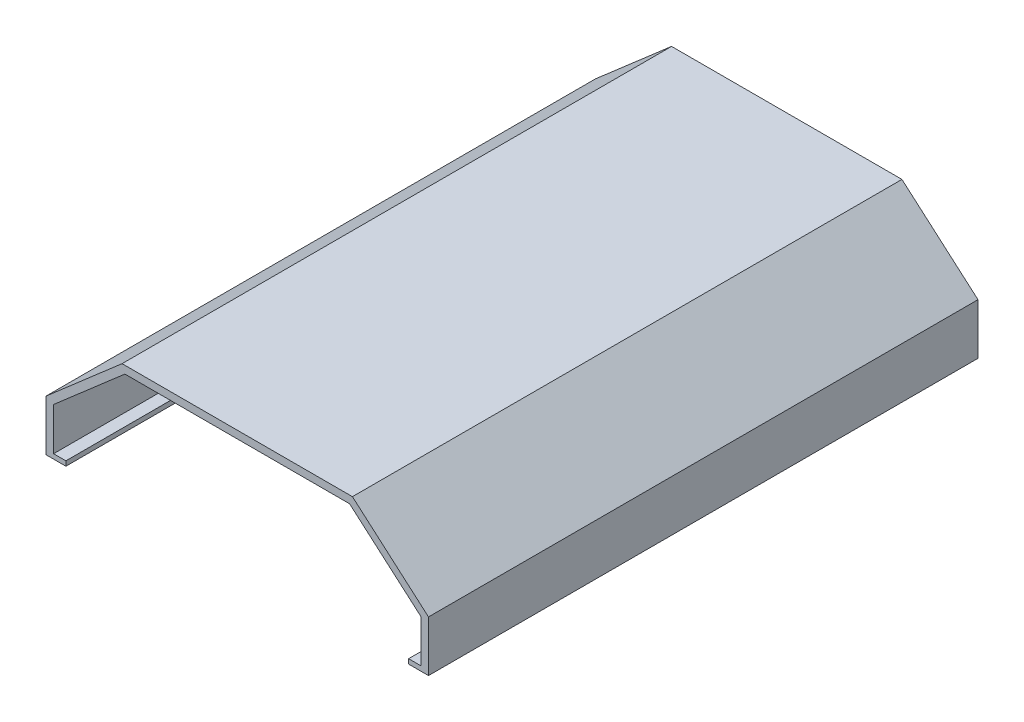
ISO-10303-21;
HEADER;
FILE_DESCRIPTION(('STEP AP214'),'2;1');
FILE_NAME('part.step','',(''),(''),'','','');
FILE_SCHEMA(('AUTOMOTIVE_DESIGN { 1 0 10303 214 1 1 1 1 }'));
ENDSEC;
DATA;
#1=APPLICATION_CONTEXT('core data for automotive mechanical design processes');
#2=APPLICATION_PROTOCOL_DEFINITION('international standard','automotive_design',2000,#1);
#3=PRODUCT_CONTEXT('',#1,'mechanical');
#4=PRODUCT('Part','Part','',(#3));
#5=PRODUCT_RELATED_PRODUCT_CATEGORY('part','',(#4));
#6=PRODUCT_DEFINITION_FORMATION('','',#4);
#7=PRODUCT_DEFINITION_CONTEXT('part definition',#1,'design');
#8=PRODUCT_DEFINITION('design','',#6,#7);
#9=PRODUCT_DEFINITION_SHAPE('','',#8);
#10=(LENGTH_UNIT() NAMED_UNIT(*) SI_UNIT(.MILLI.,.METRE.));
#11=(NAMED_UNIT(*) PLANE_ANGLE_UNIT() SI_UNIT($,.RADIAN.));
#12=(NAMED_UNIT(*) SI_UNIT($,.STERADIAN.) SOLID_ANGLE_UNIT());
#13=UNCERTAINTY_MEASURE_WITH_UNIT(LENGTH_MEASURE(1.E-05),#10,'distance_accuracy_value','');
#14=(GEOMETRIC_REPRESENTATION_CONTEXT(3) GLOBAL_UNCERTAINTY_ASSIGNED_CONTEXT((#13)) GLOBAL_UNIT_ASSIGNED_CONTEXT((#10,
#11,#12)) REPRESENTATION_CONTEXT('',''));
#15=CARTESIAN_POINT('',(0.,0.,0.));
#16=DIRECTION('',(0.,0.,1.));
#17=DIRECTION('',(1.,0.,0.));
#18=AXIS2_PLACEMENT_3D('',#15,#16,#17);
#19=CARTESIAN_POINT('',(0.,0.,0.));
#20=DIRECTION('',(0.,0.,1.));
#21=DIRECTION('',(1.,0.,0.));
#22=AXIS2_PLACEMENT_3D('',#19,#20,#21);
#23=PLANE('',#22);
#24=DIRECTION('',(0.,1.,0.));
#25=VECTOR('',#24,1.);
#26=CARTESIAN_POINT('',(103.700000000005,0.,0.));
#27=LINE('',#26,#25);
#28=CARTESIAN_POINT('',(103.700000000005,0.,0.));
#29=VERTEX_POINT('',#28);
#30=CARTESIAN_POINT('',(103.700000000005,1.3,0.));
#31=VERTEX_POINT('',#30);
#32=EDGE_CURVE('E59',#29,#31,#27,.T.);
#33=ORIENTED_EDGE('',*,*,#32,.F.);
#34=DIRECTION('',(1.,0.,0.));
#35=VECTOR('',#34,1.);
#36=CARTESIAN_POINT('',(100.3,0.,0.));
#37=LINE('',#36,#35);
#38=CARTESIAN_POINT('',(100.3,0.,0.));
#39=VERTEX_POINT('',#38);
#40=EDGE_CURVE('E183',#39,#29,#37,.T.);
#41=ORIENTED_EDGE('',*,*,#40,.F.);
#42=DIRECTION('',(0.,-1.,0.));
#43=VECTOR('',#42,1.);
#44=CARTESIAN_POINT('',(100.3,1.3,0.));
#45=LINE('',#44,#43);
#46=CARTESIAN_POINT('',(100.3,1.3,0.));
#47=VERTEX_POINT('',#46);
#48=EDGE_CURVE('E179',#47,#39,#45,.T.);
#49=ORIENTED_EDGE('',*,*,#48,.F.);
#50=DIRECTION('',(-1.,0.,0.));
#51=VECTOR('',#50,1.);
#52=CARTESIAN_POINT('',(103.700000000005,1.3,0.));
#53=LINE('',#52,#51);
#54=EDGE_CURVE('E176',#31,#47,#53,.T.);
#55=ORIENTED_EDGE('',*,*,#54,.F.);
#56=EDGE_LOOP('',(#33,#41,#49,#55));
#57=FACE_BOUND('',#56,.T.);
#58=ADVANCED_FACE('F42',(#57),#23,.F.);
#59=DIRECTION('',(0.,-1.,0.));
#60=VECTOR('',#59,1.);
#61=CARTESIAN_POINT('',(2.10000000000009,13.1,0.));
#62=LINE('',#61,#60);
#63=CARTESIAN_POINT('',(2.09999999999999,1.3,0.));
#64=VERTEX_POINT('',#63);
#65=CARTESIAN_POINT('',(2.10000000000009,0.,0.));
#66=VERTEX_POINT('',#65);
#67=EDGE_CURVE('E11',#64,#66,#62,.T.);
#68=ORIENTED_EDGE('',*,*,#67,.F.);
#69=DIRECTION('',(-1.,0.,0.));
#70=VECTOR('',#69,1.);
#71=CARTESIAN_POINT('',(2.09999999999999,1.3,0.));
#72=LINE('',#71,#70);
#73=CARTESIAN_POINT('',(5.49999999999999,1.3,0.));
#74=VERTEX_POINT('',#73);
#75=EDGE_CURVE('E191',#74,#64,#72,.T.);
#76=ORIENTED_EDGE('',*,*,#75,.F.);
#77=DIRECTION('',(0.,1.,0.));
#78=VECTOR('',#77,1.);
#79=CARTESIAN_POINT('',(5.49999999999999,1.3,0.));
#80=LINE('',#79,#78);
#81=CARTESIAN_POINT('',(5.49999999999999,0.,0.));
#82=VERTEX_POINT('',#81);
#83=EDGE_CURVE('E188',#82,#74,#80,.T.);
#84=ORIENTED_EDGE('',*,*,#83,.F.);
#85=DIRECTION('',(1.,0.,0.));
#86=VECTOR('',#85,1.);
#87=CARTESIAN_POINT('',(5.49999999999999,0.,0.));
#88=LINE('',#87,#86);
#89=EDGE_CURVE('E160',#66,#82,#88,.T.);
#90=ORIENTED_EDGE('',*,*,#89,.F.);
#91=EDGE_LOOP('',(#68,#76,#84,#90));
#92=FACE_BOUND('',#91,.T.);
#93=ADVANCED_FACE('F398',(#92),#23,.F.);
#94=CARTESIAN_POINT('',(2.10000000000009,13.1,145.));
#95=DIRECTION('',(-1.,0.,0.));
#96=DIRECTION('',(0.,-1.,0.));
#97=AXIS2_PLACEMENT_3D('',#94,#95,#96);
#98=PLANE('',#97);
#99=DIRECTION('',(0.,0.,-1.));
#100=VECTOR('',#99,1.);
#101=CARTESIAN_POINT('',(2.09999999999999,1.3,145.));
#102=LINE('',#101,#100);
#103=CARTESIAN_POINT('',(2.09999999999999,1.3,145.));
#104=VERTEX_POINT('',#103);
#105=EDGE_CURVE('E172',#104,#64,#102,.T.);
#106=ORIENTED_EDGE('',*,*,#105,.T.);
#107=ORIENTED_EDGE('',*,*,#67,.T.);
#108=DIRECTION('',(0.,0.,1.));
#109=VECTOR('',#108,1.);
#110=CARTESIAN_POINT('',(2.10000000000009,0.,-7.));
#111=LINE('',#110,#109);
#112=CARTESIAN_POINT('',(2.10000000000009,0.,-7.));
#113=VERTEX_POINT('',#112);
#114=EDGE_CURVE('E180',#113,#66,#111,.T.);
#115=ORIENTED_EDGE('',*,*,#114,.F.);
#116=DIRECTION('',(0.,-1.,0.));
#117=VECTOR('',#116,1.);
#118=CARTESIAN_POINT('',(2.10000000000009,13.1,-7.));
#119=LINE('',#118,#117);
#120=CARTESIAN_POINT('',(2.10000000000009,13.1,-7.));
#121=VERTEX_POINT('',#120);
#122=EDGE_CURVE('E261',#121,#113,#119,.T.);
#123=ORIENTED_EDGE('',*,*,#122,.F.);
#124=DIRECTION('',(0.,0.,-1.));
#125=VECTOR('',#124,1.);
#126=CARTESIAN_POINT('',(2.10000000000009,13.1,145.));
#127=LINE('',#126,#125);
#128=CARTESIAN_POINT('',(2.10000000000009,13.1,145.));
#129=VERTEX_POINT('',#128);
#130=EDGE_CURVE('E46',#129,#121,#127,.T.);
#131=ORIENTED_EDGE('',*,*,#130,.F.);
#132=DIRECTION('',(0.,1.,0.));
#133=VECTOR('',#132,1.);
#134=CARTESIAN_POINT('',(2.10000000000009,13.1,145.));
#135=LINE('',#134,#133);
#136=EDGE_CURVE('E194',#104,#129,#135,.T.);
#137=ORIENTED_EDGE('',*,*,#136,.F.);
#138=EDGE_LOOP('',(#106,#107,#115,#123,#131,#137));
#139=FACE_BOUND('',#138,.T.);
#140=ADVANCED_FACE('F44',(#139),#98,.F.);
#141=CARTESIAN_POINT('',(21.8252230641028,30.2468748100875,145.));
#142=DIRECTION('',(-0.656059028990425,0.754709580222843,0.));
#143=DIRECTION('',(-0.754709580222844,-0.656059028990425,0.));
#144=AXIS2_PLACEMENT_3D('',#141,#142,#143);
#145=PLANE('',#144);
#146=ORIENTED_EDGE('',*,*,#130,.T.);
#147=DIRECTION('',(-0.754709580222843,-0.656059028990425,0.));
#148=VECTOR('',#147,1.);
#149=CARTESIAN_POINT('',(21.8252230641028,30.2468748100875,-7.));
#150=LINE('',#149,#148);
#151=CARTESIAN_POINT('',(21.8252230641028,30.2468748100875,-7.));
#152=VERTEX_POINT('',#151);
#153=EDGE_CURVE('E254',#152,#121,#150,.T.);
#154=ORIENTED_EDGE('',*,*,#153,.F.);
#155=DIRECTION('',(0.,0.,-1.));
#156=VECTOR('',#155,1.);
#157=CARTESIAN_POINT('',(21.8252230641028,30.2468748100875,145.));
#158=LINE('',#157,#156);
#159=CARTESIAN_POINT('',(21.8252230641028,30.2468748100875,145.));
#160=VERTEX_POINT('',#159);
#161=EDGE_CURVE('E240',#160,#152,#158,.T.);
#162=ORIENTED_EDGE('',*,*,#161,.F.);
#163=DIRECTION('',(0.754709580222843,0.656059028990425,0.));
#164=VECTOR('',#163,1.);
#165=CARTESIAN_POINT('',(21.8252230641028,30.2468748100875,145.));
#166=LINE('',#165,#164);
#167=EDGE_CURVE('E103',#129,#160,#166,.T.);
#168=ORIENTED_EDGE('',*,*,#167,.F.);
#169=EDGE_LOOP('',(#146,#154,#162,#168));
#170=FACE_BOUND('',#169,.T.);
#171=ADVANCED_FACE('F252',(#170),#145,.F.);
#172=CARTESIAN_POINT('',(83.9747769358974,30.2468748100873,145.));
#173=DIRECTION('',(0.,1.,0.));
#174=DIRECTION('',(-1.,0.,0.));
#175=AXIS2_PLACEMENT_3D('',#172,#173,#174);
#176=PLANE('',#175);
#177=ORIENTED_EDGE('',*,*,#161,.T.);
#178=DIRECTION('',(-1.,0.,0.));
#179=VECTOR('',#178,1.);
#180=CARTESIAN_POINT('',(83.9747769358974,30.2468748100873,-7.));
#181=LINE('',#180,#179);
#182=CARTESIAN_POINT('',(83.9747769358974,30.2468748100873,-7.));
#183=VERTEX_POINT('',#182);
#184=EDGE_CURVE('E270',#183,#152,#181,.T.);
#185=ORIENTED_EDGE('',*,*,#184,.F.);
#186=DIRECTION('',(0.,0.,-1.));
#187=VECTOR('',#186,1.);
#188=CARTESIAN_POINT('',(83.9747769358974,30.2468748100873,145.));
#189=LINE('',#188,#187);
#190=CARTESIAN_POINT('',(83.9747769358974,30.2468748100873,145.));
#191=VERTEX_POINT('',#190);
#192=EDGE_CURVE('E237',#191,#183,#189,.T.);
#193=ORIENTED_EDGE('',*,*,#192,.F.);
#194=DIRECTION('',(1.,0.,0.));
#195=VECTOR('',#194,1.);
#196=CARTESIAN_POINT('',(83.9747769358974,30.2468748100873,145.));
#197=LINE('',#196,#195);
#198=EDGE_CURVE('E321',#160,#191,#197,.T.);
#199=ORIENTED_EDGE('',*,*,#198,.F.);
#200=EDGE_LOOP('',(#177,#185,#193,#199));
#201=FACE_BOUND('',#200,.T.);
#202=ADVANCED_FACE('F388',(#201),#176,.F.);
#203=CARTESIAN_POINT('',(83.9747769358974,30.2468748100873,145.));
#204=DIRECTION('',(0.656059028990329,0.754709580222927,0.));
#205=DIRECTION('',(-0.754709580222927,0.656059028990329,0.));
#206=AXIS2_PLACEMENT_3D('',#203,#204,#205);
#207=PLANE('',#206);
#208=ORIENTED_EDGE('',*,*,#192,.T.);
#209=DIRECTION('',(-0.754709580222927,0.656059028990329,0.));
#210=VECTOR('',#209,1.);
#211=CARTESIAN_POINT('',(103.700000000005,13.1,-7.));
#212=LINE('',#211,#210);
#213=CARTESIAN_POINT('',(103.700000000005,13.1,-7.));
#214=VERTEX_POINT('',#213);
#215=EDGE_CURVE('E306',#214,#183,#212,.T.);
#216=ORIENTED_EDGE('',*,*,#215,.F.);
#217=DIRECTION('',(0.,0.,-1.));
#218=VECTOR('',#217,1.);
#219=CARTESIAN_POINT('',(103.700000000005,13.1,145.));
#220=LINE('',#219,#218);
#221=CARTESIAN_POINT('',(103.700000000005,13.1,145.));
#222=VERTEX_POINT('',#221);
#223=EDGE_CURVE('E233',#222,#214,#220,.T.);
#224=ORIENTED_EDGE('',*,*,#223,.F.);
#225=DIRECTION('',(0.754709580222927,-0.656059028990329,0.));
#226=VECTOR('',#225,1.);
#227=CARTESIAN_POINT('',(83.9747769358974,30.2468748100873,145.));
#228=LINE('',#227,#226);
#229=EDGE_CURVE('E324',#191,#222,#228,.T.);
#230=ORIENTED_EDGE('',*,*,#229,.F.);
#231=EDGE_LOOP('',(#208,#216,#224,#230));
#232=FACE_BOUND('',#231,.T.);
#233=ADVANCED_FACE('F385',(#232),#207,.F.);
#234=CARTESIAN_POINT('',(103.700000000005,13.1,145.));
#235=DIRECTION('',(1.,0.,0.));
#236=DIRECTION('',(0.,1.,0.));
#237=AXIS2_PLACEMENT_3D('',#234,#235,#236);
#238=PLANE('',#237);
#239=ORIENTED_EDGE('',*,*,#223,.T.);
#240=DIRECTION('',(0.,1.,0.));
#241=VECTOR('',#240,1.);
#242=CARTESIAN_POINT('',(103.700000000005,0.,-7.));
#243=LINE('',#242,#241);
#244=CARTESIAN_POINT('',(103.700000000005,0.,-7.));
#245=VERTEX_POINT('',#244);
#246=EDGE_CURVE('E302',#245,#214,#243,.T.);
#247=ORIENTED_EDGE('',*,*,#246,.F.);
#248=DIRECTION('',(0.,0.,1.));
#249=VECTOR('',#248,1.);
#250=CARTESIAN_POINT('',(103.700000000005,0.,-7.));
#251=LINE('',#250,#249);
#252=EDGE_CURVE('E310',#245,#29,#251,.T.);
#253=ORIENTED_EDGE('',*,*,#252,.T.);
#254=ORIENTED_EDGE('',*,*,#32,.T.);
#255=DIRECTION('',(0.,0.,-1.));
#256=VECTOR('',#255,1.);
#257=CARTESIAN_POINT('',(103.700000000005,1.3,145.));
#258=LINE('',#257,#256);
#259=CARTESIAN_POINT('',(103.700000000005,1.3,145.));
#260=VERTEX_POINT('',#259);
#261=EDGE_CURVE('E230',#260,#31,#258,.T.);
#262=ORIENTED_EDGE('',*,*,#261,.F.);
#263=DIRECTION('',(0.,-1.,0.));
#264=VECTOR('',#263,1.);
#265=CARTESIAN_POINT('',(103.700000000005,13.1,145.));
#266=LINE('',#265,#264);
#267=EDGE_CURVE('E327',#222,#260,#266,.T.);
#268=ORIENTED_EDGE('',*,*,#267,.F.);
#269=EDGE_LOOP('',(#239,#247,#253,#254,#262,#268));
#270=FACE_BOUND('',#269,.T.);
#271=ADVANCED_FACE('F395',(#270),#238,.F.);
#272=CARTESIAN_POINT('',(103.700000000005,1.3,145.));
#273=DIRECTION('',(0.,-1.,0.));
#274=DIRECTION('',(1.,0.,0.));
#275=AXIS2_PLACEMENT_3D('',#272,#273,#274);
#276=PLANE('',#275);
#277=ORIENTED_EDGE('',*,*,#54,.T.);
#278=DIRECTION('',(0.,0.,-1.));
#279=VECTOR('',#278,1.);
#280=CARTESIAN_POINT('',(100.3,1.3,145.));
#281=LINE('',#280,#279);
#282=CARTESIAN_POINT('',(100.3,1.3,145.));
#283=VERTEX_POINT('',#282);
#284=EDGE_CURVE('E226',#283,#47,#281,.T.);
#285=ORIENTED_EDGE('',*,*,#284,.F.);
#286=DIRECTION('',(-1.,0.,0.));
#287=VECTOR('',#286,1.);
#288=CARTESIAN_POINT('',(103.700000000005,1.3,145.));
#289=LINE('',#288,#287);
#290=EDGE_CURVE('E330',#260,#283,#289,.T.);
#291=ORIENTED_EDGE('',*,*,#290,.F.);
#292=ORIENTED_EDGE('',*,*,#261,.T.);
#293=EDGE_LOOP('',(#277,#285,#291,#292));
#294=FACE_BOUND('',#293,.T.);
#295=ADVANCED_FACE('F437',(#294),#276,.F.);
#296=CARTESIAN_POINT('',(100.3,1.3,145.));
#297=DIRECTION('',(1.,0.,0.));
#298=DIRECTION('',(0.,0.,-1.));
#299=AXIS2_PLACEMENT_3D('',#296,#297,#298);
#300=PLANE('',#299);
#301=ORIENTED_EDGE('',*,*,#48,.T.);
#302=DIRECTION('',(0.,0.,-1.));
#303=VECTOR('',#302,1.);
#304=CARTESIAN_POINT('',(100.3,0.,145.));
#305=LINE('',#304,#303);
#306=CARTESIAN_POINT('',(100.3,0.,145.));
#307=VERTEX_POINT('',#306);
#308=EDGE_CURVE('E222',#307,#39,#305,.T.);
#309=ORIENTED_EDGE('',*,*,#308,.F.);
#310=DIRECTION('',(0.,-1.,0.));
#311=VECTOR('',#310,1.);
#312=CARTESIAN_POINT('',(100.3,1.3,145.));
#313=LINE('',#312,#311);
#314=EDGE_CURVE('E333',#283,#307,#313,.T.);
#315=ORIENTED_EDGE('',*,*,#314,.F.);
#316=ORIENTED_EDGE('',*,*,#284,.T.);
#317=EDGE_LOOP('',(#301,#309,#315,#316));
#318=FACE_BOUND('',#317,.T.);
#319=ADVANCED_FACE('F433',(#318),#300,.F.);
#320=CARTESIAN_POINT('',(100.3,0.,145.));
#321=DIRECTION('',(0.,1.,0.));
#322=DIRECTION('',(-1.,0.,0.));
#323=AXIS2_PLACEMENT_3D('',#320,#321,#322);
#324=PLANE('',#323);
#325=ORIENTED_EDGE('',*,*,#40,.T.);
#326=ORIENTED_EDGE('',*,*,#252,.F.);
#327=DIRECTION('',(-1.,0.,0.));
#328=VECTOR('',#327,1.);
#329=CARTESIAN_POINT('',(105.800000000005,0.,-7.));
#330=LINE('',#329,#328);
#331=CARTESIAN_POINT('',(105.800000000005,0.,-7.));
#332=VERTEX_POINT('',#331);
#333=EDGE_CURVE('E298',#332,#245,#330,.T.);
#334=ORIENTED_EDGE('',*,*,#333,.F.);
#335=DIRECTION('',(0.,0.,-1.));
#336=VECTOR('',#335,1.);
#337=CARTESIAN_POINT('',(105.800000000005,0.,145.));
#338=LINE('',#337,#336);
#339=CARTESIAN_POINT('',(105.800000000005,0.,145.));
#340=VERTEX_POINT('',#339);
#341=EDGE_CURVE('E218',#340,#332,#338,.T.);
#342=ORIENTED_EDGE('',*,*,#341,.F.);
#343=DIRECTION('',(1.,0.,0.));
#344=VECTOR('',#343,1.);
#345=CARTESIAN_POINT('',(100.3,0.,145.));
#346=LINE('',#345,#344);
#347=EDGE_CURVE('E336',#307,#340,#346,.T.);
#348=ORIENTED_EDGE('',*,*,#347,.F.);
#349=ORIENTED_EDGE('',*,*,#308,.T.);
#350=EDGE_LOOP('',(#325,#326,#334,#342,#348,#349));
#351=FACE_BOUND('',#350,.T.);
#352=ADVANCED_FACE('F429',(#351),#324,.F.);
#353=CARTESIAN_POINT('',(105.800000000005,14.0570251366185,145.));
#354=DIRECTION('',(-1.,0.,0.));
#355=DIRECTION('',(0.,-1.,0.));
#356=AXIS2_PLACEMENT_3D('',#353,#354,#355);
#357=PLANE('',#356);
#358=ORIENTED_EDGE('',*,*,#341,.T.);
#359=DIRECTION('',(0.,-1.,0.));
#360=VECTOR('',#359,1.);
#361=CARTESIAN_POINT('',(105.800000000005,14.0570251366185,-7.));
#362=LINE('',#361,#360);
#363=CARTESIAN_POINT('',(105.800000000005,14.0570251366185,-7.));
#364=VERTEX_POINT('',#363);
#365=EDGE_CURVE('E294',#364,#332,#362,.T.);
#366=ORIENTED_EDGE('',*,*,#365,.F.);
#367=DIRECTION('',(0.,0.,-1.));
#368=VECTOR('',#367,1.);
#369=CARTESIAN_POINT('',(105.800000000005,14.0570251366185,145.));
#370=LINE('',#369,#368);
#371=CARTESIAN_POINT('',(105.800000000005,14.0570251366185,145.));
#372=VERTEX_POINT('',#371);
#373=EDGE_CURVE('E214',#372,#364,#370,.T.);
#374=ORIENTED_EDGE('',*,*,#373,.F.);
#375=DIRECTION('',(0.,1.,0.));
#376=VECTOR('',#375,1.);
#377=CARTESIAN_POINT('',(105.800000000005,14.0570251366185,145.));
#378=LINE('',#377,#376);
#379=EDGE_CURVE('E339',#340,#372,#378,.T.);
#380=ORIENTED_EDGE('',*,*,#379,.F.);
#381=EDGE_LOOP('',(#358,#366,#374,#380));
#382=FACE_BOUND('',#381,.T.);
#383=ADVANCED_FACE('F425',(#382),#357,.F.);
#384=CARTESIAN_POINT('',(84.7599347628149,32.3468748100875,145.));
#385=DIRECTION('',(-0.656059028990329,-0.754709580222927,0.));
#386=DIRECTION('',(0.754709580222927,-0.656059028990329,0.));
#387=AXIS2_PLACEMENT_3D('',#384,#385,#386);
#388=PLANE('',#387);
#389=ORIENTED_EDGE('',*,*,#373,.T.);
#390=DIRECTION('',(0.754709580222927,-0.656059028990329,0.));
#391=VECTOR('',#390,1.);
#392=CARTESIAN_POINT('',(84.7599347628149,32.3468748100875,-7.));
#393=LINE('',#392,#391);
#394=CARTESIAN_POINT('',(84.7599347628149,32.3468748100875,-7.));
#395=VERTEX_POINT('',#394);
#396=EDGE_CURVE('E290',#395,#364,#393,.T.);
#397=ORIENTED_EDGE('',*,*,#396,.F.);
#398=DIRECTION('',(0.,0.,-1.));
#399=VECTOR('',#398,1.);
#400=CARTESIAN_POINT('',(84.7599347628149,32.3468748100875,145.));
#401=LINE('',#400,#399);
#402=CARTESIAN_POINT('',(84.7599347628149,32.3468748100875,145.));
#403=VERTEX_POINT('',#402);
#404=EDGE_CURVE('E210',#403,#395,#401,.T.);
#405=ORIENTED_EDGE('',*,*,#404,.F.);
#406=DIRECTION('',(-0.754709580222927,0.656059028990329,0.));
#407=VECTOR('',#406,1.);
#408=CARTESIAN_POINT('',(84.7599347628149,32.3468748100875,145.));
#409=LINE('',#408,#407);
#410=EDGE_CURVE('E342',#372,#403,#409,.T.);
#411=ORIENTED_EDGE('',*,*,#410,.F.);
#412=EDGE_LOOP('',(#389,#397,#405,#411));
#413=FACE_BOUND('',#412,.T.);
#414=ADVANCED_FACE('F421',(#413),#388,.F.);
#415=CARTESIAN_POINT('',(84.7599347628149,32.3468748100875,145.));
#416=DIRECTION('',(0.,-1.,0.));
#417=DIRECTION('',(1.,0.,0.));
#418=AXIS2_PLACEMENT_3D('',#415,#416,#417);
#419=PLANE('',#418);
#420=ORIENTED_EDGE('',*,*,#404,.T.);
#421=DIRECTION('',(1.,0.,0.));
#422=VECTOR('',#421,1.);
#423=CARTESIAN_POINT('',(21.0400652371853,32.3468748100877,-7.));
#424=LINE('',#423,#422);
#425=CARTESIAN_POINT('',(21.0400652371853,32.3468748100877,-7.));
#426=VERTEX_POINT('',#425);
#427=EDGE_CURVE('E286',#426,#395,#424,.T.);
#428=ORIENTED_EDGE('',*,*,#427,.F.);
#429=DIRECTION('',(0.,0.,-1.));
#430=VECTOR('',#429,1.);
#431=CARTESIAN_POINT('',(21.0400652371853,32.3468748100877,145.));
#432=LINE('',#431,#430);
#433=CARTESIAN_POINT('',(21.0400652371853,32.3468748100877,145.));
#434=VERTEX_POINT('',#433);
#435=EDGE_CURVE('E206',#434,#426,#432,.T.);
#436=ORIENTED_EDGE('',*,*,#435,.F.);
#437=DIRECTION('',(-1.,0.,0.));
#438=VECTOR('',#437,1.);
#439=CARTESIAN_POINT('',(84.7599347628149,32.3468748100875,145.));
#440=LINE('',#439,#438);
#441=EDGE_CURVE('E345',#403,#434,#440,.T.);
#442=ORIENTED_EDGE('',*,*,#441,.F.);
#443=EDGE_LOOP('',(#420,#428,#436,#442));
#444=FACE_BOUND('',#443,.T.);
#445=ADVANCED_FACE('F418',(#444),#419,.F.);
#446=CARTESIAN_POINT('',(21.0400652371853,32.3468748100877,145.));
#447=DIRECTION('',(0.656059028990425,-0.754709580222843,0.));
#448=DIRECTION('',(0.754709580222843,0.656059028990425,0.));
#449=AXIS2_PLACEMENT_3D('',#446,#447,#448);
#450=PLANE('',#449);
#451=ORIENTED_EDGE('',*,*,#435,.T.);
#452=DIRECTION('',(0.754709580222843,0.656059028990425,0.));
#453=VECTOR('',#452,1.);
#454=CARTESIAN_POINT('',(1.15568442050603E-13,14.0570251366185,-7.));
#455=LINE('',#454,#453);
#456=CARTESIAN_POINT('',(1.15568442050603E-13,14.0570251366185,-7.));
#457=VERTEX_POINT('',#456);
#458=EDGE_CURVE('E282',#457,#426,#455,.T.);
#459=ORIENTED_EDGE('',*,*,#458,.F.);
#460=DIRECTION('',(0.,0.,-1.));
#461=VECTOR('',#460,1.);
#462=CARTESIAN_POINT('',(1.15568442050603E-13,14.0570251366185,145.));
#463=LINE('',#462,#461);
#464=CARTESIAN_POINT('',(1.15568442050603E-13,14.0570251366185,145.));
#465=VERTEX_POINT('',#464);
#466=EDGE_CURVE('E202',#465,#457,#463,.T.);
#467=ORIENTED_EDGE('',*,*,#466,.F.);
#468=DIRECTION('',(-0.754709580222843,-0.656059028990425,0.));
#469=VECTOR('',#468,1.);
#470=CARTESIAN_POINT('',(21.0400652371853,32.3468748100877,145.));
#471=LINE('',#470,#469);
#472=EDGE_CURVE('E348',#434,#465,#471,.T.);
#473=ORIENTED_EDGE('',*,*,#472,.F.);
#474=EDGE_LOOP('',(#451,#459,#467,#473));
#475=FACE_BOUND('',#474,.T.);
#476=ADVANCED_FACE('F357',(#475),#450,.F.);
#477=CARTESIAN_POINT('',(1.15568442050603E-13,14.0570251366185,145.));
#478=DIRECTION('',(1.,0.,0.));
#479=DIRECTION('',(0.,1.,0.));
#480=AXIS2_PLACEMENT_3D('',#477,#478,#479);
#481=PLANE('',#480);
#482=ORIENTED_EDGE('',*,*,#466,.T.);
#483=DIRECTION('',(0.,1.,0.));
#484=VECTOR('',#483,1.);
#485=CARTESIAN_POINT('',(0.,0.,-7.));
#486=LINE('',#485,#484);
#487=CARTESIAN_POINT('',(0.,0.,-7.));
#488=VERTEX_POINT('',#487);
#489=EDGE_CURVE('E278',#488,#457,#486,.T.);
#490=ORIENTED_EDGE('',*,*,#489,.F.);
#491=DIRECTION('',(0.,0.,-1.));
#492=VECTOR('',#491,1.);
#493=CARTESIAN_POINT('',(0.,0.,145.));
#494=LINE('',#493,#492);
#495=CARTESIAN_POINT('',(0.,0.,145.));
#496=VERTEX_POINT('',#495);
#497=EDGE_CURVE('E164',#496,#488,#494,.T.);
#498=ORIENTED_EDGE('',*,*,#497,.F.);
#499=DIRECTION('',(0.,-1.,0.));
#500=VECTOR('',#499,1.);
#501=CARTESIAN_POINT('',(1.15568442050603E-13,14.0570251366185,145.));
#502=LINE('',#501,#500);
#503=EDGE_CURVE('E150',#465,#496,#502,.T.);
#504=ORIENTED_EDGE('',*,*,#503,.F.);
#505=EDGE_LOOP('',(#482,#490,#498,#504));
#506=FACE_BOUND('',#505,.T.);
#507=ADVANCED_FACE('F361',(#506),#481,.F.);
#508=CARTESIAN_POINT('',(5.49999999999999,0.,145.));
#509=DIRECTION('',(0.,1.,0.));
#510=DIRECTION('',(0.,0.,1.));
#511=AXIS2_PLACEMENT_3D('',#508,#509,#510);
#512=PLANE('',#511);
#513=ORIENTED_EDGE('',*,*,#497,.T.);
#514=DIRECTION('',(-1.,0.,0.));
#515=VECTOR('',#514,1.);
#516=CARTESIAN_POINT('',(2.10000000000009,0.,-7.));
#517=LINE('',#516,#515);
#518=EDGE_CURVE('E266',#113,#488,#517,.T.);
#519=ORIENTED_EDGE('',*,*,#518,.F.);
#520=ORIENTED_EDGE('',*,*,#114,.T.);
#521=ORIENTED_EDGE('',*,*,#89,.T.);
#522=DIRECTION('',(0.,0.,-1.));
#523=VECTOR('',#522,1.);
#524=CARTESIAN_POINT('',(5.49999999999999,0.,145.));
#525=LINE('',#524,#523);
#526=CARTESIAN_POINT('',(5.49999999999999,0.,145.));
#527=VERTEX_POINT('',#526);
#528=EDGE_CURVE('E157',#527,#82,#525,.T.);
#529=ORIENTED_EDGE('',*,*,#528,.F.);
#530=DIRECTION('',(1.,0.,0.));
#531=VECTOR('',#530,1.);
#532=CARTESIAN_POINT('',(5.49999999999999,0.,145.));
#533=LINE('',#532,#531);
#534=EDGE_CURVE('E143',#496,#527,#533,.T.);
#535=ORIENTED_EDGE('',*,*,#534,.F.);
#536=EDGE_LOOP('',(#513,#519,#520,#521,#529,#535));
#537=FACE_BOUND('',#536,.T.);
#538=ADVANCED_FACE('F158',(#537),#512,.F.);
#539=CARTESIAN_POINT('',(5.49999999999999,1.3,145.));
#540=DIRECTION('',(-1.,0.,0.));
#541=DIRECTION('',(0.,0.,1.));
#542=AXIS2_PLACEMENT_3D('',#539,#540,#541);
#543=PLANE('',#542);
#544=ORIENTED_EDGE('',*,*,#83,.T.);
#545=DIRECTION('',(0.,0.,-1.));
#546=VECTOR('',#545,1.);
#547=CARTESIAN_POINT('',(5.49999999999999,1.3,145.));
#548=LINE('',#547,#546);
#549=CARTESIAN_POINT('',(5.49999999999999,1.3,145.));
#550=VERTEX_POINT('',#549);
#551=EDGE_CURVE('E165',#550,#74,#548,.T.);
#552=ORIENTED_EDGE('',*,*,#551,.F.);
#553=DIRECTION('',(0.,1.,0.));
#554=VECTOR('',#553,1.);
#555=CARTESIAN_POINT('',(5.49999999999999,1.3,145.));
#556=LINE('',#555,#554);
#557=EDGE_CURVE('E147',#527,#550,#556,.T.);
#558=ORIENTED_EDGE('',*,*,#557,.F.);
#559=ORIENTED_EDGE('',*,*,#528,.T.);
#560=EDGE_LOOP('',(#544,#552,#558,#559));
#561=FACE_BOUND('',#560,.T.);
#562=ADVANCED_FACE('F167',(#561),#543,.F.);
#563=CARTESIAN_POINT('',(2.09999999999999,1.3,145.));
#564=DIRECTION('',(0.,-1.,0.));
#565=DIRECTION('',(0.,0.,-1.));
#566=AXIS2_PLACEMENT_3D('',#563,#564,#565);
#567=PLANE('',#566);
#568=ORIENTED_EDGE('',*,*,#75,.T.);
#569=ORIENTED_EDGE('',*,*,#105,.F.);
#570=DIRECTION('',(-1.,0.,0.));
#571=VECTOR('',#570,1.);
#572=CARTESIAN_POINT('',(2.09999999999999,1.3,145.));
#573=LINE('',#572,#571);
#574=EDGE_CURVE('E68',#550,#104,#573,.T.);
#575=ORIENTED_EDGE('',*,*,#574,.F.);
#576=ORIENTED_EDGE('',*,*,#551,.T.);
#577=EDGE_LOOP('',(#568,#569,#575,#576));
#578=FACE_BOUND('',#577,.T.);
#579=ADVANCED_FACE('F406',(#578),#567,.F.);
#580=CARTESIAN_POINT('',(0.,0.,145.));
#581=DIRECTION('',(0.,0.,1.));
#582=DIRECTION('',(1.,0.,0.));
#583=AXIS2_PLACEMENT_3D('',#580,#581,#582);
#584=PLANE('',#583);
#585=ORIENTED_EDGE('',*,*,#136,.T.);
#586=ORIENTED_EDGE('',*,*,#167,.T.);
#587=ORIENTED_EDGE('',*,*,#198,.T.);
#588=ORIENTED_EDGE('',*,*,#229,.T.);
#589=ORIENTED_EDGE('',*,*,#267,.T.);
#590=ORIENTED_EDGE('',*,*,#290,.T.);
#591=ORIENTED_EDGE('',*,*,#314,.T.);
#592=ORIENTED_EDGE('',*,*,#347,.T.);
#593=ORIENTED_EDGE('',*,*,#379,.T.);
#594=ORIENTED_EDGE('',*,*,#410,.T.);
#595=ORIENTED_EDGE('',*,*,#441,.T.);
#596=ORIENTED_EDGE('',*,*,#472,.T.);
#597=ORIENTED_EDGE('',*,*,#503,.T.);
#598=ORIENTED_EDGE('',*,*,#534,.T.);
#599=ORIENTED_EDGE('',*,*,#557,.T.);
#600=ORIENTED_EDGE('',*,*,#574,.T.);
#601=EDGE_LOOP('',(#585,#586,#587,#588,#589,#590,#591,#592,#593,#594,#595,#596,#597,#598,#599,#600));
#602=FACE_BOUND('',#601,.T.);
#603=ADVANCED_FACE('F145',(#602),#584,.T.);
#604=CARTESIAN_POINT('',(0.,0.,-7.));
#605=DIRECTION('',(0.,0.,1.));
#606=DIRECTION('',(1.,0.,0.));
#607=AXIS2_PLACEMENT_3D('',#604,#605,#606);
#608=PLANE('',#607);
#609=ORIENTED_EDGE('',*,*,#153,.T.);
#610=ORIENTED_EDGE('',*,*,#122,.T.);
#611=ORIENTED_EDGE('',*,*,#518,.T.);
#612=ORIENTED_EDGE('',*,*,#489,.T.);
#613=ORIENTED_EDGE('',*,*,#458,.T.);
#614=ORIENTED_EDGE('',*,*,#427,.T.);
#615=ORIENTED_EDGE('',*,*,#396,.T.);
#616=ORIENTED_EDGE('',*,*,#365,.T.);
#617=ORIENTED_EDGE('',*,*,#333,.T.);
#618=ORIENTED_EDGE('',*,*,#246,.T.);
#619=ORIENTED_EDGE('',*,*,#215,.T.);
#620=ORIENTED_EDGE('',*,*,#184,.T.);
#621=EDGE_LOOP('',(#609,#610,#611,#612,#613,#614,#615,#616,#617,#618,#619,#620));
#622=FACE_BOUND('',#621,.T.);
#623=ADVANCED_FACE('F268',(#622),#608,.F.);
#624=CLOSED_SHELL('',(#58,#93,#140,#171,#202,#233,#271,#295,#319,#352,#383,#414,#445,#476,#507,
#538,#562,#579,#603,#623));
#625=MANIFOLD_SOLID_BREP('B2',#624);
#626=ADVANCED_BREP_SHAPE_REPRESENTATION('',(#18,#625),#14);
#627=SHAPE_DEFINITION_REPRESENTATION(#9,#626);
ENDSEC;
END-ISO-10303-21;
